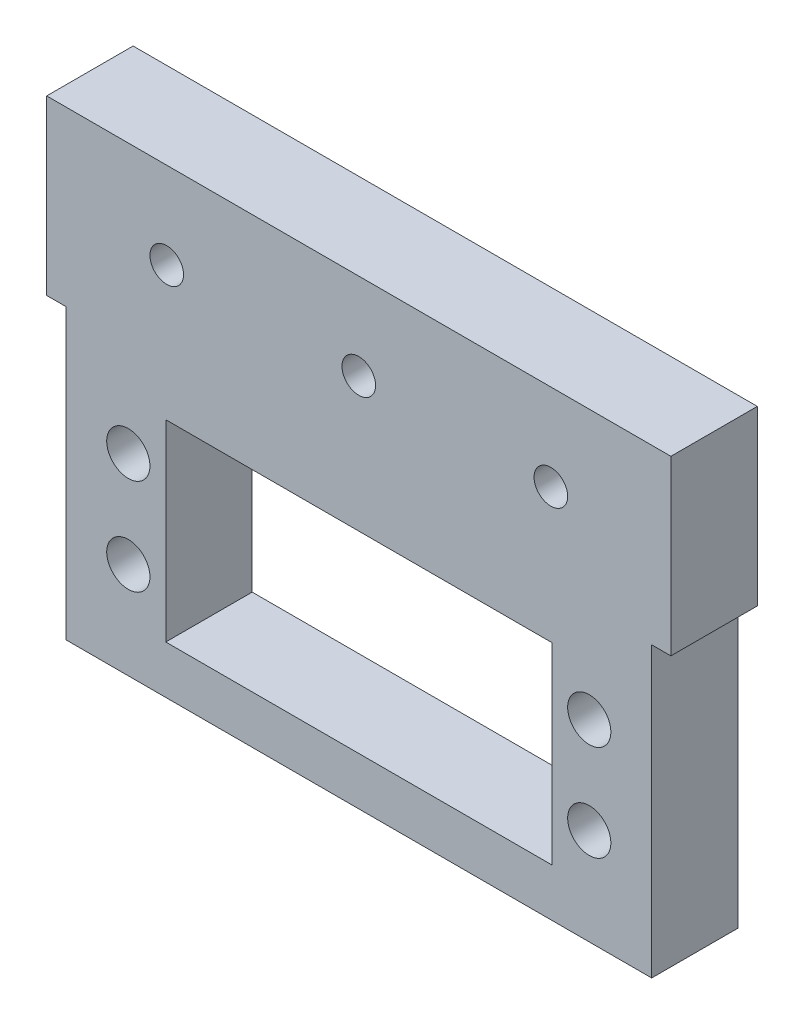
ISO-10303-21;
HEADER;
FILE_DESCRIPTION(('STEP AP214'),'2;1');
FILE_NAME('part.step','',(''),(''),'','','');
FILE_SCHEMA(('AUTOMOTIVE_DESIGN { 1 0 10303 214 1 1 1 1 }'));
ENDSEC;
DATA;
#1=APPLICATION_CONTEXT('core data for automotive mechanical design processes');
#2=APPLICATION_PROTOCOL_DEFINITION('international standard','automotive_design',2000,#1);
#3=PRODUCT_CONTEXT('',#1,'mechanical');
#4=PRODUCT('Part','Part','',(#3));
#5=PRODUCT_RELATED_PRODUCT_CATEGORY('part','',(#4));
#6=PRODUCT_DEFINITION_FORMATION('','',#4);
#7=PRODUCT_DEFINITION_CONTEXT('part definition',#1,'design');
#8=PRODUCT_DEFINITION('design','',#6,#7);
#9=PRODUCT_DEFINITION_SHAPE('','',#8);
#10=(LENGTH_UNIT() NAMED_UNIT(*) SI_UNIT(.MILLI.,.METRE.));
#11=(NAMED_UNIT(*) PLANE_ANGLE_UNIT() SI_UNIT($,.RADIAN.));
#12=(NAMED_UNIT(*) SI_UNIT($,.STERADIAN.) SOLID_ANGLE_UNIT());
#13=UNCERTAINTY_MEASURE_WITH_UNIT(LENGTH_MEASURE(1.E-05),#10,'distance_accuracy_value','');
#14=(GEOMETRIC_REPRESENTATION_CONTEXT(3) GLOBAL_UNCERTAINTY_ASSIGNED_CONTEXT((#13)) GLOBAL_UNIT_ASSIGNED_CONTEXT((#10,
#11,#12)) REPRESENTATION_CONTEXT('',''));
#15=CARTESIAN_POINT('',(0.,0.,0.));
#16=DIRECTION('',(0.,0.,1.));
#17=DIRECTION('',(1.,0.,0.));
#18=AXIS2_PLACEMENT_3D('',#15,#16,#17);
#19=CARTESIAN_POINT('',(-30.5,5.,17.));
#20=DIRECTION('',(-1.,0.,0.));
#21=DIRECTION('',(0.,-1.,0.));
#22=AXIS2_PLACEMENT_3D('',#19,#20,#21);
#23=PLANE('',#22);
#24=DIRECTION('',(0.,0.,1.));
#25=VECTOR('',#24,1.);
#26=CARTESIAN_POINT('',(-30.5,-25.05,17.));
#27=LINE('',#26,#25);
#28=CARTESIAN_POINT('',(-30.5,-25.05,17.));
#29=VERTEX_POINT('',#28);
#30=CARTESIAN_POINT('',(-30.5,-25.05,26.));
#31=VERTEX_POINT('',#30);
#32=EDGE_CURVE('E40',#29,#31,#27,.T.);
#33=ORIENTED_EDGE('',*,*,#32,.T.);
#34=DIRECTION('',(0.,-1.,0.));
#35=VECTOR('',#34,1.);
#36=CARTESIAN_POINT('',(-30.5,5.,26.));
#37=LINE('',#36,#35);
#38=CARTESIAN_POINT('',(-30.5,5.,26.));
#39=VERTEX_POINT('',#38);
#40=EDGE_CURVE('E192',#39,#31,#37,.T.);
#41=ORIENTED_EDGE('',*,*,#40,.F.);
#42=DIRECTION('',(0.,0.,1.));
#43=VECTOR('',#42,1.);
#44=CARTESIAN_POINT('',(-30.5,5.,17.));
#45=LINE('',#44,#43);
#46=CARTESIAN_POINT('',(-30.5,5.,17.));
#47=VERTEX_POINT('',#46);
#48=EDGE_CURVE('E11',#47,#39,#45,.T.);
#49=ORIENTED_EDGE('',*,*,#48,.F.);
#50=DIRECTION('',(0.,-1.,0.));
#51=VECTOR('',#50,1.);
#52=CARTESIAN_POINT('',(-30.5,5.,17.));
#53=LINE('',#52,#51);
#54=EDGE_CURVE('E136',#47,#29,#53,.T.);
#55=ORIENTED_EDGE('',*,*,#54,.T.);
#56=EDGE_LOOP('',(#33,#41,#49,#55));
#57=FACE_BOUND('',#56,.T.);
#58=ADVANCED_FACE('F37',(#57),#23,.T.);
#59=CARTESIAN_POINT('',(30.5,5.,17.));
#60=DIRECTION('',(1.,0.,0.));
#61=DIRECTION('',(0.,1.,0.));
#62=AXIS2_PLACEMENT_3D('',#59,#60,#61);
#63=PLANE('',#62);
#64=DIRECTION('',(0.,0.,1.));
#65=VECTOR('',#64,1.);
#66=CARTESIAN_POINT('',(30.5,5.,17.));
#67=LINE('',#66,#65);
#68=CARTESIAN_POINT('',(30.5,5.,17.));
#69=VERTEX_POINT('',#68);
#70=CARTESIAN_POINT('',(30.5,5.,26.));
#71=VERTEX_POINT('',#70);
#72=EDGE_CURVE('E45',#69,#71,#67,.T.);
#73=ORIENTED_EDGE('',*,*,#72,.T.);
#74=DIRECTION('',(0.,1.,0.));
#75=VECTOR('',#74,1.);
#76=CARTESIAN_POINT('',(30.5,5.,26.));
#77=LINE('',#76,#75);
#78=CARTESIAN_POINT('',(30.5,-25.05,26.));
#79=VERTEX_POINT('',#78);
#80=EDGE_CURVE('E198',#79,#71,#77,.T.);
#81=ORIENTED_EDGE('',*,*,#80,.F.);
#82=DIRECTION('',(0.,0.,1.));
#83=VECTOR('',#82,1.);
#84=CARTESIAN_POINT('',(30.5,-25.05,17.));
#85=LINE('',#84,#83);
#86=CARTESIAN_POINT('',(30.5,-25.05,17.));
#87=VERTEX_POINT('',#86);
#88=EDGE_CURVE('E61',#87,#79,#85,.T.);
#89=ORIENTED_EDGE('',*,*,#88,.F.);
#90=DIRECTION('',(0.,1.,0.));
#91=VECTOR('',#90,1.);
#92=CARTESIAN_POINT('',(30.5,5.,17.));
#93=LINE('',#92,#91);
#94=EDGE_CURVE('E235',#87,#69,#93,.T.);
#95=ORIENTED_EDGE('',*,*,#94,.T.);
#96=EDGE_LOOP('',(#73,#81,#89,#95));
#97=FACE_BOUND('',#96,.T.);
#98=ADVANCED_FACE('F257',(#97),#63,.T.);
#99=CARTESIAN_POINT('',(-30.5,-25.05,17.));
#100=DIRECTION('',(0.,-1.,0.));
#101=DIRECTION('',(0.,0.,-1.));
#102=AXIS2_PLACEMENT_3D('',#99,#100,#101);
#103=PLANE('',#102);
#104=ORIENTED_EDGE('',*,*,#88,.T.);
#105=DIRECTION('',(1.,0.,0.));
#106=VECTOR('',#105,1.);
#107=CARTESIAN_POINT('',(-30.5,-25.05,26.));
#108=LINE('',#107,#106);
#109=EDGE_CURVE('E195',#31,#79,#108,.T.);
#110=ORIENTED_EDGE('',*,*,#109,.F.);
#111=ORIENTED_EDGE('',*,*,#32,.F.);
#112=DIRECTION('',(1.,0.,0.));
#113=VECTOR('',#112,1.);
#114=CARTESIAN_POINT('',(-30.5,-25.05,17.));
#115=LINE('',#114,#113);
#116=EDGE_CURVE('E232',#29,#87,#115,.T.);
#117=ORIENTED_EDGE('',*,*,#116,.T.);
#118=EDGE_LOOP('',(#104,#110,#111,#117));
#119=FACE_BOUND('',#118,.T.);
#120=ADVANCED_FACE('F242',(#119),#103,.T.);
#121=CARTESIAN_POINT('',(0.,0.,17.));
#122=DIRECTION('',(0.,0.,1.));
#123=DIRECTION('',(1.,0.,0.));
#124=AXIS2_PLACEMENT_3D('',#121,#122,#123);
#125=PLANE('',#124);
#126=DIRECTION('',(-1.,0.,0.));
#127=VECTOR('',#126,1.);
#128=CARTESIAN_POINT('',(-20.1,0.,17.));
#129=LINE('',#128,#127);
#130=CARTESIAN_POINT('',(20.1,0.,17.));
#131=VERTEX_POINT('',#130);
#132=CARTESIAN_POINT('',(-20.1,0.,17.));
#133=VERTEX_POINT('',#132);
#134=EDGE_CURVE('E208',#131,#133,#129,.T.);
#135=ORIENTED_EDGE('',*,*,#134,.T.);
#136=DIRECTION('',(0.,-1.,0.));
#137=VECTOR('',#136,1.);
#138=CARTESIAN_POINT('',(-20.1,0.,17.));
#139=LINE('',#138,#137);
#140=CARTESIAN_POINT('',(-20.1,-20.05,17.));
#141=VERTEX_POINT('',#140);
#142=EDGE_CURVE('E201',#133,#141,#139,.T.);
#143=ORIENTED_EDGE('',*,*,#142,.T.);
#144=DIRECTION('',(1.,0.,0.));
#145=VECTOR('',#144,1.);
#146=CARTESIAN_POINT('',(-20.1,-20.05,17.));
#147=LINE('',#146,#145);
#148=CARTESIAN_POINT('',(20.1,-20.05,17.));
#149=VERTEX_POINT('',#148);
#150=EDGE_CURVE('E204',#141,#149,#147,.T.);
#151=ORIENTED_EDGE('',*,*,#150,.T.);
#152=DIRECTION('',(0.,1.,0.));
#153=VECTOR('',#152,1.);
#154=CARTESIAN_POINT('',(20.1,0.,17.));
#155=LINE('',#154,#153);
#156=EDGE_CURVE('E53',#149,#131,#155,.T.);
#157=ORIENTED_EDGE('',*,*,#156,.T.);
#158=EDGE_LOOP('',(#135,#143,#151,#157));
#159=FACE_BOUND('',#158,.T.);
#160=CARTESIAN_POINT('',(24.,-15.,17.));
#161=DIRECTION('',(0.,0.,1.));
#162=DIRECTION('',(1.,0.,0.));
#163=AXIS2_PLACEMENT_3D('',#160,#161,#162);
#164=CIRCLE('',#163,2.25);
#165=CARTESIAN_POINT('',(26.25,-15.,17.));
#166=VERTEX_POINT('',#165);
#167=EDGE_CURVE('E214',#166,#166,#164,.T.);
#168=ORIENTED_EDGE('',*,*,#167,.T.);
#169=EDGE_LOOP('',(#168));
#170=FACE_BOUND('',#169,.T.);
#171=CARTESIAN_POINT('',(24.,-5.,17.));
#172=DIRECTION('',(0.,0.,1.));
#173=DIRECTION('',(1.,0.,0.));
#174=AXIS2_PLACEMENT_3D('',#171,#172,#173);
#175=CIRCLE('',#174,2.25);
#176=CARTESIAN_POINT('',(26.25,-5.,17.));
#177=VERTEX_POINT('',#176);
#178=EDGE_CURVE('E222',#177,#177,#175,.T.);
#179=ORIENTED_EDGE('',*,*,#178,.T.);
#180=EDGE_LOOP('',(#179));
#181=FACE_BOUND('',#180,.T.);
#182=CARTESIAN_POINT('',(-24.,-15.,17.));
#183=DIRECTION('',(0.,0.,1.));
#184=DIRECTION('',(1.,0.,0.));
#185=AXIS2_PLACEMENT_3D('',#182,#183,#184);
#186=CIRCLE('',#185,2.25);
#187=CARTESIAN_POINT('',(-21.75,-15.,17.));
#188=VERTEX_POINT('',#187);
#189=EDGE_CURVE('E225',#188,#188,#186,.T.);
#190=ORIENTED_EDGE('',*,*,#189,.T.);
#191=EDGE_LOOP('',(#190));
#192=FACE_BOUND('',#191,.T.);
#193=CARTESIAN_POINT('',(-24.,-5.,17.));
#194=DIRECTION('',(0.,0.,1.));
#195=DIRECTION('',(1.,0.,0.));
#196=AXIS2_PLACEMENT_3D('',#193,#194,#195);
#197=CIRCLE('',#196,2.25);
#198=CARTESIAN_POINT('',(-21.75,-5.,17.));
#199=VERTEX_POINT('',#198);
#200=EDGE_CURVE('E228',#199,#199,#197,.T.);
#201=ORIENTED_EDGE('',*,*,#200,.T.);
#202=EDGE_LOOP('',(#201));
#203=FACE_BOUND('',#202,.T.);
#204=ORIENTED_EDGE('',*,*,#54,.F.);
#205=DIRECTION('',(-1.,0.,0.));
#206=VECTOR('',#205,1.);
#207=CARTESIAN_POINT('',(32.5,5.,17.));
#208=LINE('',#207,#206);
#209=CARTESIAN_POINT('',(-32.5,5.,17.));
#210=VERTEX_POINT('',#209);
#211=EDGE_CURVE('E127',#47,#210,#208,.T.);
#212=ORIENTED_EDGE('',*,*,#211,.T.);
#213=DIRECTION('',(0.,1.,0.));
#214=VECTOR('',#213,1.);
#215=CARTESIAN_POINT('',(-32.5,5.,17.));
#216=LINE('',#215,#214);
#217=CARTESIAN_POINT('',(-32.5,23.,17.));
#218=VERTEX_POINT('',#217);
#219=EDGE_CURVE('E133',#210,#218,#216,.T.);
#220=ORIENTED_EDGE('',*,*,#219,.T.);
#221=DIRECTION('',(-1.,0.,0.));
#222=VECTOR('',#221,1.);
#223=CARTESIAN_POINT('',(32.5,23.,17.));
#224=LINE('',#223,#222);
#225=CARTESIAN_POINT('',(32.5,23.,17.));
#226=VERTEX_POINT('',#225);
#227=EDGE_CURVE('E249',#226,#218,#224,.T.);
#228=ORIENTED_EDGE('',*,*,#227,.F.);
#229=DIRECTION('',(0.,1.,0.));
#230=VECTOR('',#229,1.);
#231=CARTESIAN_POINT('',(32.5,5.,17.));
#232=LINE('',#231,#230);
#233=CARTESIAN_POINT('',(32.5,5.,17.));
#234=VERTEX_POINT('',#233);
#235=EDGE_CURVE('E151',#234,#226,#232,.T.);
#236=ORIENTED_EDGE('',*,*,#235,.F.);
#237=EDGE_CURVE('E139',#234,#69,#208,.T.);
#238=ORIENTED_EDGE('',*,*,#237,.T.);
#239=ORIENTED_EDGE('',*,*,#94,.F.);
#240=ORIENTED_EDGE('',*,*,#116,.F.);
#241=EDGE_LOOP('',(#204,#212,#220,#228,#236,#238,#239,#240));
#242=FACE_BOUND('',#241,.T.);
#243=CARTESIAN_POINT('',(-20.,14.,17.));
#244=DIRECTION('',(0.,0.,-1.));
#245=DIRECTION('',(-1.,0.,0.));
#246=AXIS2_PLACEMENT_3D('',#243,#244,#245);
#247=CIRCLE('',#246,1.75);
#248=CARTESIAN_POINT('',(-21.75,14.,17.));
#249=VERTEX_POINT('',#248);
#250=EDGE_CURVE('E268',#249,#249,#247,.T.);
#251=ORIENTED_EDGE('',*,*,#250,.F.);
#252=EDGE_LOOP('',(#251));
#253=FACE_BOUND('',#252,.T.);
#254=CARTESIAN_POINT('',(0.,14.,17.));
#255=DIRECTION('',(0.,0.,-1.));
#256=DIRECTION('',(-1.,0.,0.));
#257=AXIS2_PLACEMENT_3D('',#254,#255,#256);
#258=CIRCLE('',#257,1.75);
#259=CARTESIAN_POINT('',(-1.75,14.,17.));
#260=VERTEX_POINT('',#259);
#261=EDGE_CURVE('E273',#260,#260,#258,.T.);
#262=ORIENTED_EDGE('',*,*,#261,.F.);
#263=EDGE_LOOP('',(#262));
#264=FACE_BOUND('',#263,.T.);
#265=CARTESIAN_POINT('',(20.,14.,17.));
#266=DIRECTION('',(0.,0.,-1.));
#267=DIRECTION('',(-1.,0.,0.));
#268=AXIS2_PLACEMENT_3D('',#265,#266,#267);
#269=CIRCLE('',#268,1.75);
#270=CARTESIAN_POINT('',(18.25,14.,17.));
#271=VERTEX_POINT('',#270);
#272=EDGE_CURVE('E279',#271,#271,#269,.T.);
#273=ORIENTED_EDGE('',*,*,#272,.F.);
#274=EDGE_LOOP('',(#273));
#275=FACE_BOUND('',#274,.T.);
#276=ADVANCED_FACE('F129',(#159,#170,#181,#192,#203,#242,#253,#264,#275),#125,.F.);
#277=CARTESIAN_POINT('',(-24.,-5.,17.));
#278=DIRECTION('',(0.,0.,1.));
#279=DIRECTION('',(1.,0.,0.));
#280=AXIS2_PLACEMENT_3D('',#277,#278,#279);
#281=CYLINDRICAL_SURFACE('',#280,2.25);
#282=ORIENTED_EDGE('',*,*,#200,.F.);
#283=EDGE_LOOP('',(#282));
#284=FACE_BOUND('',#283,.T.);
#285=CARTESIAN_POINT('',(-24.,-5.,26.));
#286=DIRECTION('',(0.,0.,1.));
#287=DIRECTION('',(1.,0.,0.));
#288=AXIS2_PLACEMENT_3D('',#285,#286,#287);
#289=CIRCLE('',#288,2.25);
#290=CARTESIAN_POINT('',(-21.75,-5.,26.));
#291=VERTEX_POINT('',#290);
#292=EDGE_CURVE('E189',#291,#291,#289,.T.);
#293=ORIENTED_EDGE('',*,*,#292,.T.);
#294=EDGE_LOOP('',(#293));
#295=FACE_BOUND('',#294,.T.);
#296=ADVANCED_FACE('F309',(#284,#295),#281,.F.);
#297=CARTESIAN_POINT('',(-24.,-15.,17.));
#298=DIRECTION('',(0.,0.,1.));
#299=DIRECTION('',(1.,0.,0.));
#300=AXIS2_PLACEMENT_3D('',#297,#298,#299);
#301=CYLINDRICAL_SURFACE('',#300,2.25);
#302=ORIENTED_EDGE('',*,*,#189,.F.);
#303=EDGE_LOOP('',(#302));
#304=FACE_BOUND('',#303,.T.);
#305=CARTESIAN_POINT('',(-24.,-15.,26.));
#306=DIRECTION('',(0.,0.,1.));
#307=DIRECTION('',(1.,0.,0.));
#308=AXIS2_PLACEMENT_3D('',#305,#306,#307);
#309=CIRCLE('',#308,2.25);
#310=CARTESIAN_POINT('',(-21.75,-15.,26.));
#311=VERTEX_POINT('',#310);
#312=EDGE_CURVE('E186',#311,#311,#309,.T.);
#313=ORIENTED_EDGE('',*,*,#312,.T.);
#314=EDGE_LOOP('',(#313));
#315=FACE_BOUND('',#314,.T.);
#316=ADVANCED_FACE('F313',(#304,#315),#301,.F.);
#317=CARTESIAN_POINT('',(24.,-5.,17.));
#318=DIRECTION('',(0.,0.,1.));
#319=DIRECTION('',(1.,0.,0.));
#320=AXIS2_PLACEMENT_3D('',#317,#318,#319);
#321=CYLINDRICAL_SURFACE('',#320,2.25);
#322=ORIENTED_EDGE('',*,*,#178,.F.);
#323=EDGE_LOOP('',(#322));
#324=FACE_BOUND('',#323,.T.);
#325=CARTESIAN_POINT('',(24.,-5.,26.));
#326=DIRECTION('',(0.,0.,1.));
#327=DIRECTION('',(1.,0.,0.));
#328=AXIS2_PLACEMENT_3D('',#325,#326,#327);
#329=CIRCLE('',#328,2.25);
#330=CARTESIAN_POINT('',(26.25,-5.,26.));
#331=VERTEX_POINT('',#330);
#332=EDGE_CURVE('E183',#331,#331,#329,.T.);
#333=ORIENTED_EDGE('',*,*,#332,.T.);
#334=EDGE_LOOP('',(#333));
#335=FACE_BOUND('',#334,.T.);
#336=ADVANCED_FACE('F317',(#324,#335),#321,.F.);
#337=CARTESIAN_POINT('',(24.,-15.,17.));
#338=DIRECTION('',(0.,0.,1.));
#339=DIRECTION('',(1.,0.,0.));
#340=AXIS2_PLACEMENT_3D('',#337,#338,#339);
#341=CYLINDRICAL_SURFACE('',#340,2.25);
#342=ORIENTED_EDGE('',*,*,#167,.F.);
#343=EDGE_LOOP('',(#342));
#344=FACE_BOUND('',#343,.T.);
#345=CARTESIAN_POINT('',(24.,-15.,26.));
#346=DIRECTION('',(0.,0.,1.));
#347=DIRECTION('',(1.,0.,0.));
#348=AXIS2_PLACEMENT_3D('',#345,#346,#347);
#349=CIRCLE('',#348,2.25);
#350=CARTESIAN_POINT('',(26.25,-15.,26.));
#351=VERTEX_POINT('',#350);
#352=EDGE_CURVE('E180',#351,#351,#349,.T.);
#353=ORIENTED_EDGE('',*,*,#352,.T.);
#354=EDGE_LOOP('',(#353));
#355=FACE_BOUND('',#354,.T.);
#356=ADVANCED_FACE('F321',(#344,#355),#341,.F.);
#357=CARTESIAN_POINT('',(-20.1,0.,17.));
#358=DIRECTION('',(-1.,0.,0.));
#359=DIRECTION('',(0.,-1.,0.));
#360=AXIS2_PLACEMENT_3D('',#357,#358,#359);
#361=PLANE('',#360);
#362=DIRECTION('',(0.,0.,1.));
#363=VECTOR('',#362,1.);
#364=CARTESIAN_POINT('',(-20.1,0.,17.));
#365=LINE('',#364,#363);
#366=CARTESIAN_POINT('',(-20.1,0.,26.));
#367=VERTEX_POINT('',#366);
#368=EDGE_CURVE('E212',#133,#367,#365,.T.);
#369=ORIENTED_EDGE('',*,*,#368,.T.);
#370=DIRECTION('',(0.,-1.,0.));
#371=VECTOR('',#370,1.);
#372=CARTESIAN_POINT('',(-20.1,0.,26.));
#373=LINE('',#372,#371);
#374=CARTESIAN_POINT('',(-20.1,-20.05,26.));
#375=VERTEX_POINT('',#374);
#376=EDGE_CURVE('E156',#367,#375,#373,.T.);
#377=ORIENTED_EDGE('',*,*,#376,.T.);
#378=DIRECTION('',(0.,0.,1.));
#379=VECTOR('',#378,1.);
#380=CARTESIAN_POINT('',(-20.1,-20.05,17.));
#381=LINE('',#380,#379);
#382=EDGE_CURVE('E211',#141,#375,#381,.T.);
#383=ORIENTED_EDGE('',*,*,#382,.F.);
#384=ORIENTED_EDGE('',*,*,#142,.F.);
#385=EDGE_LOOP('',(#369,#377,#383,#384));
#386=FACE_BOUND('',#385,.T.);
#387=ADVANCED_FACE('F325',(#386),#361,.F.);
#388=CARTESIAN_POINT('',(-20.1,0.,17.));
#389=DIRECTION('',(0.,1.,0.));
#390=DIRECTION('',(0.,0.,1.));
#391=AXIS2_PLACEMENT_3D('',#388,#389,#390);
#392=PLANE('',#391);
#393=DIRECTION('',(0.,0.,1.));
#394=VECTOR('',#393,1.);
#395=CARTESIAN_POINT('',(20.1,0.,17.));
#396=LINE('',#395,#394);
#397=CARTESIAN_POINT('',(20.1,0.,26.));
#398=VERTEX_POINT('',#397);
#399=EDGE_CURVE('E215',#131,#398,#396,.T.);
#400=ORIENTED_EDGE('',*,*,#399,.T.);
#401=DIRECTION('',(-1.,0.,0.));
#402=VECTOR('',#401,1.);
#403=CARTESIAN_POINT('',(-20.1,0.,26.));
#404=LINE('',#403,#402);
#405=EDGE_CURVE('E177',#398,#367,#404,.T.);
#406=ORIENTED_EDGE('',*,*,#405,.T.);
#407=ORIENTED_EDGE('',*,*,#368,.F.);
#408=ORIENTED_EDGE('',*,*,#134,.F.);
#409=EDGE_LOOP('',(#400,#406,#407,#408));
#410=FACE_BOUND('',#409,.T.);
#411=ADVANCED_FACE('F329',(#410),#392,.F.);
#412=CARTESIAN_POINT('',(20.1,0.,17.));
#413=DIRECTION('',(1.,0.,0.));
#414=DIRECTION('',(0.,1.,0.));
#415=AXIS2_PLACEMENT_3D('',#412,#413,#414);
#416=PLANE('',#415);
#417=DIRECTION('',(0.,0.,1.));
#418=VECTOR('',#417,1.);
#419=CARTESIAN_POINT('',(20.1,-20.05,17.));
#420=LINE('',#419,#418);
#421=CARTESIAN_POINT('',(20.1,-20.05,26.));
#422=VERTEX_POINT('',#421);
#423=EDGE_CURVE('E217',#149,#422,#420,.T.);
#424=ORIENTED_EDGE('',*,*,#423,.T.);
#425=DIRECTION('',(0.,1.,0.));
#426=VECTOR('',#425,1.);
#427=CARTESIAN_POINT('',(20.1,0.,26.));
#428=LINE('',#427,#426);
#429=EDGE_CURVE('E174',#422,#398,#428,.T.);
#430=ORIENTED_EDGE('',*,*,#429,.T.);
#431=ORIENTED_EDGE('',*,*,#399,.F.);
#432=ORIENTED_EDGE('',*,*,#156,.F.);
#433=EDGE_LOOP('',(#424,#430,#431,#432));
#434=FACE_BOUND('',#433,.T.);
#435=ADVANCED_FACE('F334',(#434),#416,.F.);
#436=CARTESIAN_POINT('',(-20.1,-20.05,17.));
#437=DIRECTION('',(0.,-1.,0.));
#438=DIRECTION('',(0.,0.,-1.));
#439=AXIS2_PLACEMENT_3D('',#436,#437,#438);
#440=PLANE('',#439);
#441=ORIENTED_EDGE('',*,*,#382,.T.);
#442=DIRECTION('',(1.,0.,0.));
#443=VECTOR('',#442,1.);
#444=CARTESIAN_POINT('',(-20.1,-20.05,26.));
#445=LINE('',#444,#443);
#446=EDGE_CURVE('E159',#375,#422,#445,.T.);
#447=ORIENTED_EDGE('',*,*,#446,.T.);
#448=ORIENTED_EDGE('',*,*,#423,.F.);
#449=ORIENTED_EDGE('',*,*,#150,.F.);
#450=EDGE_LOOP('',(#441,#447,#448,#449));
#451=FACE_BOUND('',#450,.T.);
#452=ADVANCED_FACE('F331',(#451),#440,.F.);
#453=CARTESIAN_POINT('',(0.,0.,26.));
#454=DIRECTION('',(0.,0.,1.));
#455=DIRECTION('',(1.,0.,0.));
#456=AXIS2_PLACEMENT_3D('',#453,#454,#455);
#457=PLANE('',#456);
#458=ORIENTED_EDGE('',*,*,#332,.F.);
#459=EDGE_LOOP('',(#458));
#460=FACE_BOUND('',#459,.T.);
#461=ORIENTED_EDGE('',*,*,#292,.F.);
#462=EDGE_LOOP('',(#461));
#463=FACE_BOUND('',#462,.T.);
#464=ORIENTED_EDGE('',*,*,#40,.T.);
#465=ORIENTED_EDGE('',*,*,#109,.T.);
#466=ORIENTED_EDGE('',*,*,#80,.T.);
#467=DIRECTION('',(-1.,0.,0.));
#468=VECTOR('',#467,1.);
#469=CARTESIAN_POINT('',(32.5,5.,26.));
#470=LINE('',#469,#468);
#471=CARTESIAN_POINT('',(32.5,5.,26.));
#472=VERTEX_POINT('',#471);
#473=EDGE_CURVE('E140',#472,#71,#470,.T.);
#474=ORIENTED_EDGE('',*,*,#473,.F.);
#475=DIRECTION('',(0.,-1.,0.));
#476=VECTOR('',#475,1.);
#477=CARTESIAN_POINT('',(32.5,5.,26.));
#478=LINE('',#477,#476);
#479=CARTESIAN_POINT('',(32.5,23.,26.));
#480=VERTEX_POINT('',#479);
#481=EDGE_CURVE('E166',#480,#472,#478,.T.);
#482=ORIENTED_EDGE('',*,*,#481,.F.);
#483=DIRECTION('',(-1.,0.,0.));
#484=VECTOR('',#483,1.);
#485=CARTESIAN_POINT('',(32.5,23.,26.));
#486=LINE('',#485,#484);
#487=CARTESIAN_POINT('',(-32.5,23.,26.));
#488=VERTEX_POINT('',#487);
#489=EDGE_CURVE('E247',#480,#488,#486,.T.);
#490=ORIENTED_EDGE('',*,*,#489,.T.);
#491=DIRECTION('',(0.,-1.,0.));
#492=VECTOR('',#491,1.);
#493=CARTESIAN_POINT('',(-32.5,5.,26.));
#494=LINE('',#493,#492);
#495=CARTESIAN_POINT('',(-32.5,5.,26.));
#496=VERTEX_POINT('',#495);
#497=EDGE_CURVE('E150',#488,#496,#494,.T.);
#498=ORIENTED_EDGE('',*,*,#497,.T.);
#499=EDGE_CURVE('E146',#39,#496,#470,.T.);
#500=ORIENTED_EDGE('',*,*,#499,.F.);
#501=EDGE_LOOP('',(#464,#465,#466,#474,#482,#490,#498,#500));
#502=FACE_BOUND('',#501,.T.);
#503=ORIENTED_EDGE('',*,*,#312,.F.);
#504=EDGE_LOOP('',(#503));
#505=FACE_BOUND('',#504,.T.);
#506=ORIENTED_EDGE('',*,*,#352,.F.);
#507=EDGE_LOOP('',(#506));
#508=FACE_BOUND('',#507,.T.);
#509=ORIENTED_EDGE('',*,*,#446,.F.);
#510=ORIENTED_EDGE('',*,*,#376,.F.);
#511=ORIENTED_EDGE('',*,*,#405,.F.);
#512=ORIENTED_EDGE('',*,*,#429,.F.);
#513=EDGE_LOOP('',(#509,#510,#511,#512));
#514=FACE_BOUND('',#513,.T.);
#515=CARTESIAN_POINT('',(-20.,14.,26.));
#516=DIRECTION('',(0.,0.,1.));
#517=DIRECTION('',(1.,0.,0.));
#518=AXIS2_PLACEMENT_3D('',#515,#516,#517);
#519=CIRCLE('',#518,1.75);
#520=CARTESIAN_POINT('',(-21.75,14.,26.));
#521=VERTEX_POINT('',#520);
#522=EDGE_CURVE('E266',#521,#521,#519,.F.);
#523=ORIENTED_EDGE('',*,*,#522,.T.);
#524=EDGE_LOOP('',(#523));
#525=FACE_BOUND('',#524,.T.);
#526=CARTESIAN_POINT('',(0.,14.,26.));
#527=DIRECTION('',(0.,0.,1.));
#528=DIRECTION('',(1.,0.,0.));
#529=AXIS2_PLACEMENT_3D('',#526,#527,#528);
#530=CIRCLE('',#529,1.75);
#531=CARTESIAN_POINT('',(-1.75,14.,26.));
#532=VERTEX_POINT('',#531);
#533=EDGE_CURVE('E276',#532,#532,#530,.F.);
#534=ORIENTED_EDGE('',*,*,#533,.T.);
#535=EDGE_LOOP('',(#534));
#536=FACE_BOUND('',#535,.T.);
#537=CARTESIAN_POINT('',(20.,14.,26.));
#538=DIRECTION('',(0.,0.,1.));
#539=DIRECTION('',(1.,0.,0.));
#540=AXIS2_PLACEMENT_3D('',#537,#538,#539);
#541=CIRCLE('',#540,1.75);
#542=CARTESIAN_POINT('',(18.25,14.,26.));
#543=VERTEX_POINT('',#542);
#544=EDGE_CURVE('E282',#543,#543,#541,.F.);
#545=ORIENTED_EDGE('',*,*,#544,.T.);
#546=EDGE_LOOP('',(#545));
#547=FACE_BOUND('',#546,.T.);
#548=ADVANCED_FACE('F244',(#460,#463,#502,#505,#508,#514,#525,#536,#547),#457,.T.);
#549=CARTESIAN_POINT('',(32.5,5.,17.));
#550=DIRECTION('',(0.,1.,0.));
#551=DIRECTION('',(0.,0.,1.));
#552=AXIS2_PLACEMENT_3D('',#549,#550,#551);
#553=PLANE('',#552);
#554=ORIENTED_EDGE('',*,*,#211,.F.);
#555=ORIENTED_EDGE('',*,*,#48,.T.);
#556=ORIENTED_EDGE('',*,*,#499,.T.);
#557=DIRECTION('',(0.,0.,-1.));
#558=VECTOR('',#557,1.);
#559=CARTESIAN_POINT('',(-32.5,5.,17.));
#560=LINE('',#559,#558);
#561=EDGE_CURVE('E143',#496,#210,#560,.T.);
#562=ORIENTED_EDGE('',*,*,#561,.T.);
#563=EDGE_LOOP('',(#554,#555,#556,#562));
#564=FACE_BOUND('',#563,.T.);
#565=ADVANCED_FACE('F144',(#564),#553,.F.);
#566=CARTESIAN_POINT('',(32.5,23.,17.));
#567=DIRECTION('',(0.,-1.,0.));
#568=DIRECTION('',(0.,0.,-1.));
#569=AXIS2_PLACEMENT_3D('',#566,#567,#568);
#570=PLANE('',#569);
#571=DIRECTION('',(0.,0.,1.));
#572=VECTOR('',#571,1.);
#573=CARTESIAN_POINT('',(-32.5,23.,17.));
#574=LINE('',#573,#572);
#575=EDGE_CURVE('E154',#218,#488,#574,.T.);
#576=ORIENTED_EDGE('',*,*,#575,.T.);
#577=ORIENTED_EDGE('',*,*,#489,.F.);
#578=DIRECTION('',(0.,0.,1.));
#579=VECTOR('',#578,1.);
#580=CARTESIAN_POINT('',(32.5,23.,17.));
#581=LINE('',#580,#579);
#582=EDGE_CURVE('E168',#226,#480,#581,.T.);
#583=ORIENTED_EDGE('',*,*,#582,.F.);
#584=ORIENTED_EDGE('',*,*,#227,.T.);
#585=EDGE_LOOP('',(#576,#577,#583,#584));
#586=FACE_BOUND('',#585,.T.);
#587=ADVANCED_FACE('F265',(#586),#570,.F.);
#588=ORIENTED_EDGE('',*,*,#72,.F.);
#589=ORIENTED_EDGE('',*,*,#237,.F.);
#590=DIRECTION('',(0.,0.,-1.));
#591=VECTOR('',#590,1.);
#592=CARTESIAN_POINT('',(32.5,5.,17.));
#593=LINE('',#592,#591);
#594=EDGE_CURVE('E164',#472,#234,#593,.T.);
#595=ORIENTED_EDGE('',*,*,#594,.F.);
#596=ORIENTED_EDGE('',*,*,#473,.T.);
#597=EDGE_LOOP('',(#588,#589,#595,#596));
#598=FACE_BOUND('',#597,.T.);
#599=ADVANCED_FACE('F260',(#598),#553,.F.);
#600=CARTESIAN_POINT('',(32.5,0.,0.));
#601=DIRECTION('',(1.,0.,0.));
#602=DIRECTION('',(0.,0.,-1.));
#603=AXIS2_PLACEMENT_3D('',#600,#601,#602);
#604=PLANE('',#603);
#605=ORIENTED_EDGE('',*,*,#235,.T.);
#606=ORIENTED_EDGE('',*,*,#582,.T.);
#607=ORIENTED_EDGE('',*,*,#481,.T.);
#608=ORIENTED_EDGE('',*,*,#594,.T.);
#609=EDGE_LOOP('',(#605,#606,#607,#608));
#610=FACE_BOUND('',#609,.T.);
#611=ADVANCED_FACE('F262',(#610),#604,.T.);
#612=CARTESIAN_POINT('',(-32.5,0.,0.));
#613=DIRECTION('',(1.,0.,0.));
#614=DIRECTION('',(0.,0.,-1.));
#615=AXIS2_PLACEMENT_3D('',#612,#613,#614);
#616=PLANE('',#615);
#617=ORIENTED_EDGE('',*,*,#219,.F.);
#618=ORIENTED_EDGE('',*,*,#561,.F.);
#619=ORIENTED_EDGE('',*,*,#497,.F.);
#620=ORIENTED_EDGE('',*,*,#575,.F.);
#621=EDGE_LOOP('',(#617,#618,#619,#620));
#622=FACE_BOUND('',#621,.T.);
#623=ADVANCED_FACE('F153',(#622),#616,.F.);
#624=CARTESIAN_POINT('',(-20.,14.,38.0208152801713));
#625=DIRECTION('',(0.,0.,-1.));
#626=DIRECTION('',(-1.,0.,0.));
#627=AXIS2_PLACEMENT_3D('',#624,#625,#626);
#628=CYLINDRICAL_SURFACE('',#627,1.75);
#629=CARTESIAN_POINT('',(-21.75,14.,17.));
#630=CARTESIAN_POINT('',(-21.75,14.,17.09375));
#631=CARTESIAN_POINT('',(-21.75,14.,17.1875));
#632=CARTESIAN_POINT('',(-21.75,14.,17.375));
#633=CARTESIAN_POINT('',(-21.75,14.,17.46875));
#634=CARTESIAN_POINT('',(-21.75,14.,17.65625));
#635=CARTESIAN_POINT('',(-21.75,14.,17.75));
#636=CARTESIAN_POINT('',(-21.75,14.,17.9375));
#637=CARTESIAN_POINT('',(-21.75,14.,18.03125));
#638=CARTESIAN_POINT('',(-21.75,14.,18.21875));
#639=CARTESIAN_POINT('',(-21.75,14.,18.3125));
#640=CARTESIAN_POINT('',(-21.75,14.,18.5));
#641=CARTESIAN_POINT('',(-21.75,14.,18.59375));
#642=CARTESIAN_POINT('',(-21.75,14.,18.78125));
#643=CARTESIAN_POINT('',(-21.75,14.,18.875));
#644=CARTESIAN_POINT('',(-21.75,14.,19.0625));
#645=CARTESIAN_POINT('',(-21.75,14.,19.15625));
#646=CARTESIAN_POINT('',(-21.75,14.,19.34375));
#647=CARTESIAN_POINT('',(-21.75,14.,19.4375));
#648=CARTESIAN_POINT('',(-21.75,14.,19.625));
#649=CARTESIAN_POINT('',(-21.75,14.,19.71875));
#650=CARTESIAN_POINT('',(-21.75,14.,19.90625));
#651=CARTESIAN_POINT('',(-21.75,14.,20.));
#652=CARTESIAN_POINT('',(-21.75,14.,20.1875));
#653=CARTESIAN_POINT('',(-21.75,14.,20.28125));
#654=CARTESIAN_POINT('',(-21.75,14.,20.46875));
#655=CARTESIAN_POINT('',(-21.75,14.,20.5625));
#656=CARTESIAN_POINT('',(-21.75,14.,20.75));
#657=CARTESIAN_POINT('',(-21.75,14.,20.84375));
#658=CARTESIAN_POINT('',(-21.75,14.,21.03125));
#659=CARTESIAN_POINT('',(-21.75,14.,21.125));
#660=CARTESIAN_POINT('',(-21.75,14.,21.3125));
#661=CARTESIAN_POINT('',(-21.75,14.,21.40625));
#662=CARTESIAN_POINT('',(-21.75,14.,21.59375));
#663=CARTESIAN_POINT('',(-21.75,14.,21.6875));
#664=CARTESIAN_POINT('',(-21.75,14.,21.875));
#665=CARTESIAN_POINT('',(-21.75,14.,21.96875));
#666=CARTESIAN_POINT('',(-21.75,14.,22.15625));
#667=CARTESIAN_POINT('',(-21.75,14.,22.25));
#668=CARTESIAN_POINT('',(-21.75,14.,22.4375));
#669=CARTESIAN_POINT('',(-21.75,14.,22.53125));
#670=CARTESIAN_POINT('',(-21.75,14.,22.71875));
#671=CARTESIAN_POINT('',(-21.75,14.,22.8125));
#672=CARTESIAN_POINT('',(-21.75,14.,23.));
#673=CARTESIAN_POINT('',(-21.75,14.,23.09375));
#674=CARTESIAN_POINT('',(-21.75,14.,23.28125));
#675=CARTESIAN_POINT('',(-21.75,14.,23.375));
#676=CARTESIAN_POINT('',(-21.75,14.,23.5625));
#677=CARTESIAN_POINT('',(-21.75,14.,23.65625));
#678=CARTESIAN_POINT('',(-21.75,14.,23.84375));
#679=CARTESIAN_POINT('',(-21.75,14.,23.9375));
#680=CARTESIAN_POINT('',(-21.75,14.,24.125));
#681=CARTESIAN_POINT('',(-21.75,14.,24.21875));
#682=CARTESIAN_POINT('',(-21.75,14.,24.40625));
#683=CARTESIAN_POINT('',(-21.75,14.,24.5));
#684=CARTESIAN_POINT('',(-21.75,14.,24.6875));
#685=CARTESIAN_POINT('',(-21.75,14.,24.78125));
#686=CARTESIAN_POINT('',(-21.75,14.,24.96875));
#687=CARTESIAN_POINT('',(-21.75,14.,25.0625));
#688=CARTESIAN_POINT('',(-21.75,14.,25.25));
#689=CARTESIAN_POINT('',(-21.75,14.,25.34375));
#690=CARTESIAN_POINT('',(-21.75,14.,25.53125));
#691=CARTESIAN_POINT('',(-21.75,14.,25.625));
#692=CARTESIAN_POINT('',(-21.75,14.,25.8125));
#693=CARTESIAN_POINT('',(-21.75,14.,25.90625));
#694=CARTESIAN_POINT('',(-21.75,14.,26.));
#695=B_SPLINE_CURVE_WITH_KNOTS('',3,(#629,#630,#631,#632,#633,#634,#635,#636,#637,#638,#639,
#640,#641,#642,#643,#644,#645,#646,#647,#648,#649,#650,#651,#652,#653,#654,#655,#656,#657,#658,
#659,#660,#661,#662,#663,#664,#665,#666,#667,#668,#669,#670,#671,#672,#673,#674,#675,#676,#677,
#678,#679,#680,#681,#682,#683,#684,#685,#686,#687,#688,#689,#690,#691,#692,#693,#694),
.UNSPECIFIED.,.F.,.F.,(4,2,2,2,2,2,2,2,2,2,2,2,2,2,2,2,2,2,2,2,2,2,2,2,2,2,2,2,2,2,2,2,4),(0.,
0.28125,0.5625,0.843750000000001,1.125,1.40625,1.6875,1.96875,2.25,2.53125,2.8125,3.09375,3.375,
3.65625,3.9375,4.21875,4.5,4.78125,5.0625,5.34375,5.62499999999999,5.90625,6.18749999999999,
6.46875,6.75,7.03125,7.3125,7.59375,7.875,8.15625,8.4375,8.71874999999999,9.),.UNSPECIFIED.);
#696=EDGE_CURVE('BSEAM295',#249,#521,#695,.T.);
#697=ORIENTED_EDGE('',*,*,#250,.T.);
#698=ORIENTED_EDGE('',*,*,#522,.F.);
#699=ORIENTED_EDGE('',*,*,#696,.T.);
#700=ORIENTED_EDGE('',*,*,#696,.F.);
#701=EDGE_LOOP('',(#697,#699,#698,#700));
#702=FACE_BOUND('',#701,.T.);
#703=ADVANCED_FACE('F295',(#702),#628,.F.);
#704=CARTESIAN_POINT('',(0.,14.,38.0208152801713));
#705=DIRECTION('',(0.,0.,-1.));
#706=DIRECTION('',(-1.,0.,0.));
#707=AXIS2_PLACEMENT_3D('',#704,#705,#706);
#708=CYLINDRICAL_SURFACE('',#707,1.75);
#709=CARTESIAN_POINT('',(-1.75,14.,17.));
#710=CARTESIAN_POINT('',(-1.75,14.,17.09375));
#711=CARTESIAN_POINT('',(-1.75,14.,17.1875));
#712=CARTESIAN_POINT('',(-1.75,14.,17.375));
#713=CARTESIAN_POINT('',(-1.75,14.,17.46875));
#714=CARTESIAN_POINT('',(-1.75,14.,17.65625));
#715=CARTESIAN_POINT('',(-1.75,14.,17.75));
#716=CARTESIAN_POINT('',(-1.75,14.,17.9375));
#717=CARTESIAN_POINT('',(-1.75,14.,18.03125));
#718=CARTESIAN_POINT('',(-1.75,14.,18.21875));
#719=CARTESIAN_POINT('',(-1.75,14.,18.3125));
#720=CARTESIAN_POINT('',(-1.75,14.,18.5));
#721=CARTESIAN_POINT('',(-1.75,14.,18.59375));
#722=CARTESIAN_POINT('',(-1.75,14.,18.78125));
#723=CARTESIAN_POINT('',(-1.75,14.,18.875));
#724=CARTESIAN_POINT('',(-1.75,14.,19.0625));
#725=CARTESIAN_POINT('',(-1.75,14.,19.15625));
#726=CARTESIAN_POINT('',(-1.75,14.,19.34375));
#727=CARTESIAN_POINT('',(-1.75,14.,19.4375));
#728=CARTESIAN_POINT('',(-1.75,14.,19.625));
#729=CARTESIAN_POINT('',(-1.75,14.,19.71875));
#730=CARTESIAN_POINT('',(-1.75,14.,19.90625));
#731=CARTESIAN_POINT('',(-1.75,14.,20.));
#732=CARTESIAN_POINT('',(-1.75,14.,20.1875));
#733=CARTESIAN_POINT('',(-1.75,14.,20.28125));
#734=CARTESIAN_POINT('',(-1.75,14.,20.46875));
#735=CARTESIAN_POINT('',(-1.75,14.,20.5625));
#736=CARTESIAN_POINT('',(-1.75,14.,20.75));
#737=CARTESIAN_POINT('',(-1.75,14.,20.84375));
#738=CARTESIAN_POINT('',(-1.75,14.,21.03125));
#739=CARTESIAN_POINT('',(-1.75,14.,21.125));
#740=CARTESIAN_POINT('',(-1.75,14.,21.3125));
#741=CARTESIAN_POINT('',(-1.75,14.,21.40625));
#742=CARTESIAN_POINT('',(-1.75,14.,21.59375));
#743=CARTESIAN_POINT('',(-1.75,14.,21.6875));
#744=CARTESIAN_POINT('',(-1.75,14.,21.875));
#745=CARTESIAN_POINT('',(-1.75,14.,21.96875));
#746=CARTESIAN_POINT('',(-1.75,14.,22.15625));
#747=CARTESIAN_POINT('',(-1.75,14.,22.25));
#748=CARTESIAN_POINT('',(-1.75,14.,22.4375));
#749=CARTESIAN_POINT('',(-1.75,14.,22.53125));
#750=CARTESIAN_POINT('',(-1.75,14.,22.71875));
#751=CARTESIAN_POINT('',(-1.75,14.,22.8125));
#752=CARTESIAN_POINT('',(-1.75,14.,23.));
#753=CARTESIAN_POINT('',(-1.75,14.,23.09375));
#754=CARTESIAN_POINT('',(-1.75,14.,23.28125));
#755=CARTESIAN_POINT('',(-1.75,14.,23.375));
#756=CARTESIAN_POINT('',(-1.75,14.,23.5625));
#757=CARTESIAN_POINT('',(-1.75,14.,23.65625));
#758=CARTESIAN_POINT('',(-1.75,14.,23.84375));
#759=CARTESIAN_POINT('',(-1.75,14.,23.9375));
#760=CARTESIAN_POINT('',(-1.75,14.,24.125));
#761=CARTESIAN_POINT('',(-1.75,14.,24.21875));
#762=CARTESIAN_POINT('',(-1.75,14.,24.40625));
#763=CARTESIAN_POINT('',(-1.75,14.,24.5));
#764=CARTESIAN_POINT('',(-1.75,14.,24.6875));
#765=CARTESIAN_POINT('',(-1.75,14.,24.78125));
#766=CARTESIAN_POINT('',(-1.75,14.,24.96875));
#767=CARTESIAN_POINT('',(-1.75,14.,25.0625));
#768=CARTESIAN_POINT('',(-1.75,14.,25.25));
#769=CARTESIAN_POINT('',(-1.75,14.,25.34375));
#770=CARTESIAN_POINT('',(-1.75,14.,25.53125));
#771=CARTESIAN_POINT('',(-1.75,14.,25.625));
#772=CARTESIAN_POINT('',(-1.75,14.,25.8125));
#773=CARTESIAN_POINT('',(-1.75,14.,25.90625));
#774=CARTESIAN_POINT('',(-1.75,14.,26.));
#775=B_SPLINE_CURVE_WITH_KNOTS('',3,(#709,#710,#711,#712,#713,#714,#715,#716,#717,#718,#719,
#720,#721,#722,#723,#724,#725,#726,#727,#728,#729,#730,#731,#732,#733,#734,#735,#736,#737,#738,
#739,#740,#741,#742,#743,#744,#745,#746,#747,#748,#749,#750,#751,#752,#753,#754,#755,#756,#757,
#758,#759,#760,#761,#762,#763,#764,#765,#766,#767,#768,#769,#770,#771,#772,#773,#774),
.UNSPECIFIED.,.F.,.F.,(4,2,2,2,2,2,2,2,2,2,2,2,2,2,2,2,2,2,2,2,2,2,2,2,2,2,2,2,2,2,2,2,4),(0.,
0.28125,0.5625,0.843750000000001,1.125,1.40625,1.6875,1.96875,2.25,2.53125,2.8125,3.09375,3.375,
3.65625,3.9375,4.21875,4.5,4.78125,5.0625,5.34375,5.62499999999999,5.90625,6.18749999999999,
6.46875,6.75,7.03125,7.3125,7.59375,7.875,8.15625,8.4375,8.71874999999999,9.),.UNSPECIFIED.);
#776=EDGE_CURVE('BSEAM289',#260,#532,#775,.T.);
#777=ORIENTED_EDGE('',*,*,#261,.T.);
#778=ORIENTED_EDGE('',*,*,#533,.F.);
#779=ORIENTED_EDGE('',*,*,#776,.T.);
#780=ORIENTED_EDGE('',*,*,#776,.F.);
#781=EDGE_LOOP('',(#777,#779,#778,#780));
#782=FACE_BOUND('',#781,.T.);
#783=ADVANCED_FACE('F289',(#782),#708,.F.);
#784=CARTESIAN_POINT('',(20.,14.,38.0208152801713));
#785=DIRECTION('',(0.,0.,-1.));
#786=DIRECTION('',(-1.,0.,0.));
#787=AXIS2_PLACEMENT_3D('',#784,#785,#786);
#788=CYLINDRICAL_SURFACE('',#787,1.75);
#789=CARTESIAN_POINT('',(18.25,14.,17.));
#790=CARTESIAN_POINT('',(18.25,14.,17.09375));
#791=CARTESIAN_POINT('',(18.25,14.,17.1875));
#792=CARTESIAN_POINT('',(18.25,14.,17.375));
#793=CARTESIAN_POINT('',(18.25,14.,17.46875));
#794=CARTESIAN_POINT('',(18.25,14.,17.65625));
#795=CARTESIAN_POINT('',(18.25,14.,17.75));
#796=CARTESIAN_POINT('',(18.25,14.,17.9375));
#797=CARTESIAN_POINT('',(18.25,14.,18.03125));
#798=CARTESIAN_POINT('',(18.25,14.,18.21875));
#799=CARTESIAN_POINT('',(18.25,14.,18.3125));
#800=CARTESIAN_POINT('',(18.25,14.,18.5));
#801=CARTESIAN_POINT('',(18.25,14.,18.59375));
#802=CARTESIAN_POINT('',(18.25,14.,18.78125));
#803=CARTESIAN_POINT('',(18.25,14.,18.875));
#804=CARTESIAN_POINT('',(18.25,14.,19.0625));
#805=CARTESIAN_POINT('',(18.25,14.,19.15625));
#806=CARTESIAN_POINT('',(18.25,14.,19.34375));
#807=CARTESIAN_POINT('',(18.25,14.,19.4375));
#808=CARTESIAN_POINT('',(18.25,14.,19.625));
#809=CARTESIAN_POINT('',(18.25,14.,19.71875));
#810=CARTESIAN_POINT('',(18.25,14.,19.90625));
#811=CARTESIAN_POINT('',(18.25,14.,20.));
#812=CARTESIAN_POINT('',(18.25,14.,20.1875));
#813=CARTESIAN_POINT('',(18.25,14.,20.28125));
#814=CARTESIAN_POINT('',(18.25,14.,20.46875));
#815=CARTESIAN_POINT('',(18.25,14.,20.5625));
#816=CARTESIAN_POINT('',(18.25,14.,20.75));
#817=CARTESIAN_POINT('',(18.25,14.,20.84375));
#818=CARTESIAN_POINT('',(18.25,14.,21.03125));
#819=CARTESIAN_POINT('',(18.25,14.,21.125));
#820=CARTESIAN_POINT('',(18.25,14.,21.3125));
#821=CARTESIAN_POINT('',(18.25,14.,21.40625));
#822=CARTESIAN_POINT('',(18.25,14.,21.59375));
#823=CARTESIAN_POINT('',(18.25,14.,21.6875));
#824=CARTESIAN_POINT('',(18.25,14.,21.875));
#825=CARTESIAN_POINT('',(18.25,14.,21.96875));
#826=CARTESIAN_POINT('',(18.25,14.,22.15625));
#827=CARTESIAN_POINT('',(18.25,14.,22.25));
#828=CARTESIAN_POINT('',(18.25,14.,22.4375));
#829=CARTESIAN_POINT('',(18.25,14.,22.53125));
#830=CARTESIAN_POINT('',(18.25,14.,22.71875));
#831=CARTESIAN_POINT('',(18.25,14.,22.8125));
#832=CARTESIAN_POINT('',(18.25,14.,23.));
#833=CARTESIAN_POINT('',(18.25,14.,23.09375));
#834=CARTESIAN_POINT('',(18.25,14.,23.28125));
#835=CARTESIAN_POINT('',(18.25,14.,23.375));
#836=CARTESIAN_POINT('',(18.25,14.,23.5625));
#837=CARTESIAN_POINT('',(18.25,14.,23.65625));
#838=CARTESIAN_POINT('',(18.25,14.,23.84375));
#839=CARTESIAN_POINT('',(18.25,14.,23.9375));
#840=CARTESIAN_POINT('',(18.25,14.,24.125));
#841=CARTESIAN_POINT('',(18.25,14.,24.21875));
#842=CARTESIAN_POINT('',(18.25,14.,24.40625));
#843=CARTESIAN_POINT('',(18.25,14.,24.5));
#844=CARTESIAN_POINT('',(18.25,14.,24.6875));
#845=CARTESIAN_POINT('',(18.25,14.,24.78125));
#846=CARTESIAN_POINT('',(18.25,14.,24.96875));
#847=CARTESIAN_POINT('',(18.25,14.,25.0625));
#848=CARTESIAN_POINT('',(18.25,14.,25.25));
#849=CARTESIAN_POINT('',(18.25,14.,25.34375));
#850=CARTESIAN_POINT('',(18.25,14.,25.53125));
#851=CARTESIAN_POINT('',(18.25,14.,25.625));
#852=CARTESIAN_POINT('',(18.25,14.,25.8125));
#853=CARTESIAN_POINT('',(18.25,14.,25.90625));
#854=CARTESIAN_POINT('',(18.25,14.,26.));
#855=B_SPLINE_CURVE_WITH_KNOTS('',3,(#789,#790,#791,#792,#793,#794,#795,#796,#797,#798,#799,
#800,#801,#802,#803,#804,#805,#806,#807,#808,#809,#810,#811,#812,#813,#814,#815,#816,#817,#818,
#819,#820,#821,#822,#823,#824,#825,#826,#827,#828,#829,#830,#831,#832,#833,#834,#835,#836,#837,
#838,#839,#840,#841,#842,#843,#844,#845,#846,#847,#848,#849,#850,#851,#852,#853,#854),
.UNSPECIFIED.,.F.,.F.,(4,2,2,2,2,2,2,2,2,2,2,2,2,2,2,2,2,2,2,2,2,2,2,2,2,2,2,2,2,2,2,2,4),(0.,
0.28125,0.5625,0.843750000000001,1.125,1.40625,1.6875,1.96875,2.25,2.53125,2.8125,3.09375,3.375,
3.65625,3.9375,4.21875,4.5,4.78125,5.0625,5.34375,5.62499999999999,5.90625,6.18749999999999,
6.46875,6.75,7.03125,7.3125,7.59375,7.875,8.15625,8.4375,8.71874999999999,9.),.UNSPECIFIED.);
#856=EDGE_CURVE('BSEAM287',#271,#543,#855,.T.);
#857=ORIENTED_EDGE('',*,*,#272,.T.);
#858=ORIENTED_EDGE('',*,*,#544,.F.);
#859=ORIENTED_EDGE('',*,*,#856,.T.);
#860=ORIENTED_EDGE('',*,*,#856,.F.);
#861=EDGE_LOOP('',(#857,#859,#858,#860));
#862=FACE_BOUND('',#861,.T.);
#863=ADVANCED_FACE('F287',(#862),#788,.F.);
#864=CLOSED_SHELL('',(#58,#98,#120,#276,#296,#316,#336,#356,#387,#411,#435,#452,#548,#565,#587,
#599,#611,#623,#703,#783,#863));
#865=MANIFOLD_SOLID_BREP('B2',#864);
#866=ADVANCED_BREP_SHAPE_REPRESENTATION('',(#18,#865),#14);
#867=SHAPE_DEFINITION_REPRESENTATION(#9,#866);
ENDSEC;
END-ISO-10303-21;
